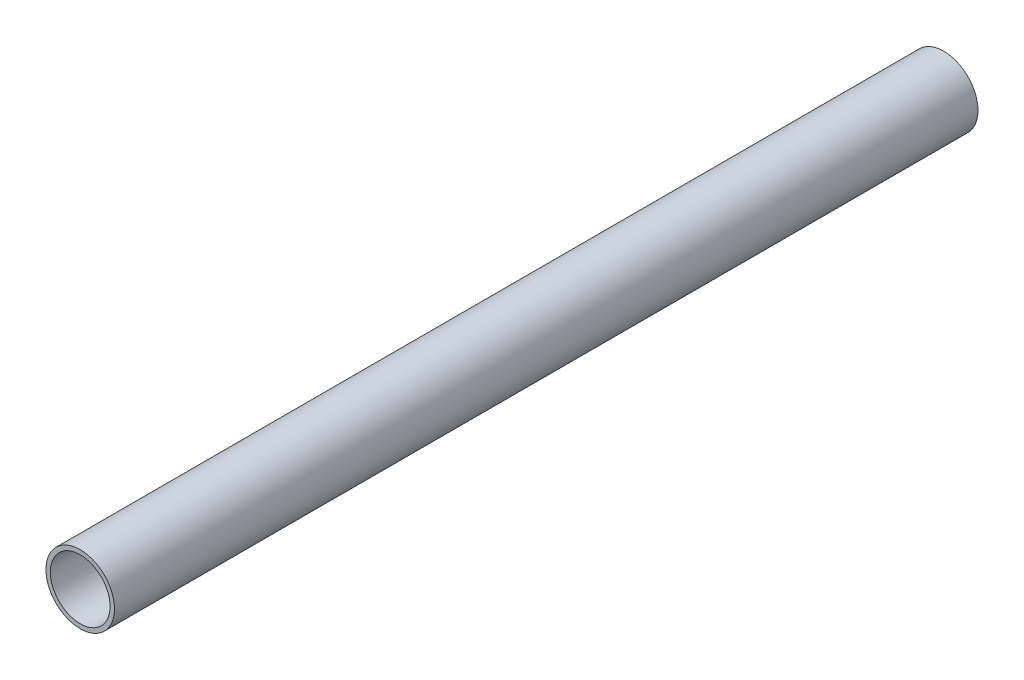
ISO-10303-21;
HEADER;
FILE_DESCRIPTION(('STEP AP214'),'2;1');
FILE_NAME('part.step','',(''),(''),'','','');
FILE_SCHEMA(('AUTOMOTIVE_DESIGN { 1 0 10303 214 1 1 1 1 }'));
ENDSEC;
DATA;
#1=APPLICATION_CONTEXT('core data for automotive mechanical design processes');
#2=APPLICATION_PROTOCOL_DEFINITION('international standard','automotive_design',2000,#1);
#3=PRODUCT_CONTEXT('',#1,'mechanical');
#4=PRODUCT('Part','Part','',(#3));
#5=PRODUCT_RELATED_PRODUCT_CATEGORY('part','',(#4));
#6=PRODUCT_DEFINITION_FORMATION('','',#4);
#7=PRODUCT_DEFINITION_CONTEXT('part definition',#1,'design');
#8=PRODUCT_DEFINITION('design','',#6,#7);
#9=PRODUCT_DEFINITION_SHAPE('','',#8);
#10=(LENGTH_UNIT() NAMED_UNIT(*) SI_UNIT(.MILLI.,.METRE.));
#11=(NAMED_UNIT(*) PLANE_ANGLE_UNIT() SI_UNIT($,.RADIAN.));
#12=(NAMED_UNIT(*) SI_UNIT($,.STERADIAN.) SOLID_ANGLE_UNIT());
#13=UNCERTAINTY_MEASURE_WITH_UNIT(LENGTH_MEASURE(1.E-05),#10,'distance_accuracy_value','');
#14=(GEOMETRIC_REPRESENTATION_CONTEXT(3) GLOBAL_UNCERTAINTY_ASSIGNED_CONTEXT((#13)) GLOBAL_UNIT_ASSIGNED_CONTEXT((#10,
#11,#12)) REPRESENTATION_CONTEXT('',''));
#15=CARTESIAN_POINT('',(0.,0.,0.));
#16=DIRECTION('',(0.,0.,1.));
#17=DIRECTION('',(1.,0.,0.));
#18=AXIS2_PLACEMENT_3D('',#15,#16,#17);
#19=CARTESIAN_POINT('',(0.,0.,100.));
#20=DIRECTION('',(0.,0.,1.));
#21=DIRECTION('',(1.,0.,0.));
#22=AXIS2_PLACEMENT_3D('',#19,#20,#21);
#23=PLANE('',#22);
#24=CARTESIAN_POINT('',(0.,0.,100.));
#25=DIRECTION('',(0.,0.,1.));
#26=DIRECTION('',(1.,0.,0.));
#27=AXIS2_PLACEMENT_3D('',#24,#25,#26);
#28=CIRCLE('',#27,7.9375);
#29=CARTESIAN_POINT('',(7.9375,0.,100.));
#30=VERTEX_POINT('',#29);
#31=EDGE_CURVE('E10',#30,#30,#28,.T.);
#32=ORIENTED_EDGE('',*,*,#31,.T.);
#33=EDGE_LOOP('',(#32));
#34=FACE_BOUND('',#33,.T.);
#35=CARTESIAN_POINT('',(0.,0.,100.));
#36=DIRECTION('',(0.,0.,1.));
#37=DIRECTION('',(1.,0.,0.));
#38=AXIS2_PLACEMENT_3D('',#35,#36,#37);
#39=CIRCLE('',#38,6.9215);
#40=CARTESIAN_POINT('',(6.9215,0.,100.));
#41=VERTEX_POINT('',#40);
#42=EDGE_CURVE('E42',#41,#41,#39,.T.);
#43=ORIENTED_EDGE('',*,*,#42,.F.);
#44=EDGE_LOOP('',(#43));
#45=FACE_BOUND('',#44,.T.);
#46=ADVANCED_FACE('F31',(#34,#45),#23,.T.);
#47=CARTESIAN_POINT('',(0.,0.,-100.));
#48=DIRECTION('',(0.,0.,1.));
#49=DIRECTION('',(1.,0.,0.));
#50=AXIS2_PLACEMENT_3D('',#47,#48,#49);
#51=PLANE('',#50);
#52=CARTESIAN_POINT('',(0.,0.,-100.));
#53=DIRECTION('',(0.,0.,1.));
#54=DIRECTION('',(1.,0.,0.));
#55=AXIS2_PLACEMENT_3D('',#52,#53,#54);
#56=CIRCLE('',#55,7.9375);
#57=CARTESIAN_POINT('',(7.9375,0.,-100.));
#58=VERTEX_POINT('',#57);
#59=EDGE_CURVE('E35',#58,#58,#56,.T.);
#60=ORIENTED_EDGE('',*,*,#59,.F.);
#61=EDGE_LOOP('',(#60));
#62=FACE_BOUND('',#61,.T.);
#63=CARTESIAN_POINT('',(0.,0.,-100.));
#64=DIRECTION('',(0.,0.,1.));
#65=DIRECTION('',(1.,0.,0.));
#66=AXIS2_PLACEMENT_3D('',#63,#64,#65);
#67=CIRCLE('',#66,6.9215);
#68=CARTESIAN_POINT('',(6.9215,0.,-100.));
#69=VERTEX_POINT('',#68);
#70=EDGE_CURVE('E44',#69,#69,#67,.T.);
#71=ORIENTED_EDGE('',*,*,#70,.T.);
#72=EDGE_LOOP('',(#71));
#73=FACE_BOUND('',#72,.T.);
#74=ADVANCED_FACE('F54',(#62,#73),#51,.F.);
#75=CARTESIAN_POINT('',(0.,0.,100.));
#76=DIRECTION('',(0.,0.,-1.));
#77=DIRECTION('',(-1.,0.,0.));
#78=AXIS2_PLACEMENT_3D('',#75,#76,#77);
#79=CYLINDRICAL_SURFACE('',#78,7.9375);
#80=ORIENTED_EDGE('',*,*,#31,.F.);
#81=EDGE_LOOP('',(#80));
#82=FACE_BOUND('',#81,.T.);
#83=ORIENTED_EDGE('',*,*,#59,.T.);
#84=EDGE_LOOP('',(#83));
#85=FACE_BOUND('',#84,.T.);
#86=ADVANCED_FACE('F33',(#82,#85),#79,.T.);
#87=CARTESIAN_POINT('',(0.,0.,100.));
#88=DIRECTION('',(0.,0.,-1.));
#89=DIRECTION('',(-1.,0.,0.));
#90=AXIS2_PLACEMENT_3D('',#87,#88,#89);
#91=CYLINDRICAL_SURFACE('',#90,6.9215);
#92=ORIENTED_EDGE('',*,*,#42,.T.);
#93=EDGE_LOOP('',(#92));
#94=FACE_BOUND('',#93,.T.);
#95=ORIENTED_EDGE('',*,*,#70,.F.);
#96=EDGE_LOOP('',(#95));
#97=FACE_BOUND('',#96,.T.);
#98=ADVANCED_FACE('F50',(#94,#97),#91,.F.);
#99=CLOSED_SHELL('',(#46,#74,#86,#98));
#100=MANIFOLD_SOLID_BREP('B2',#99);
#101=ADVANCED_BREP_SHAPE_REPRESENTATION('',(#18,#100),#14);
#102=SHAPE_DEFINITION_REPRESENTATION(#9,#101);
ENDSEC;
END-ISO-10303-21;
